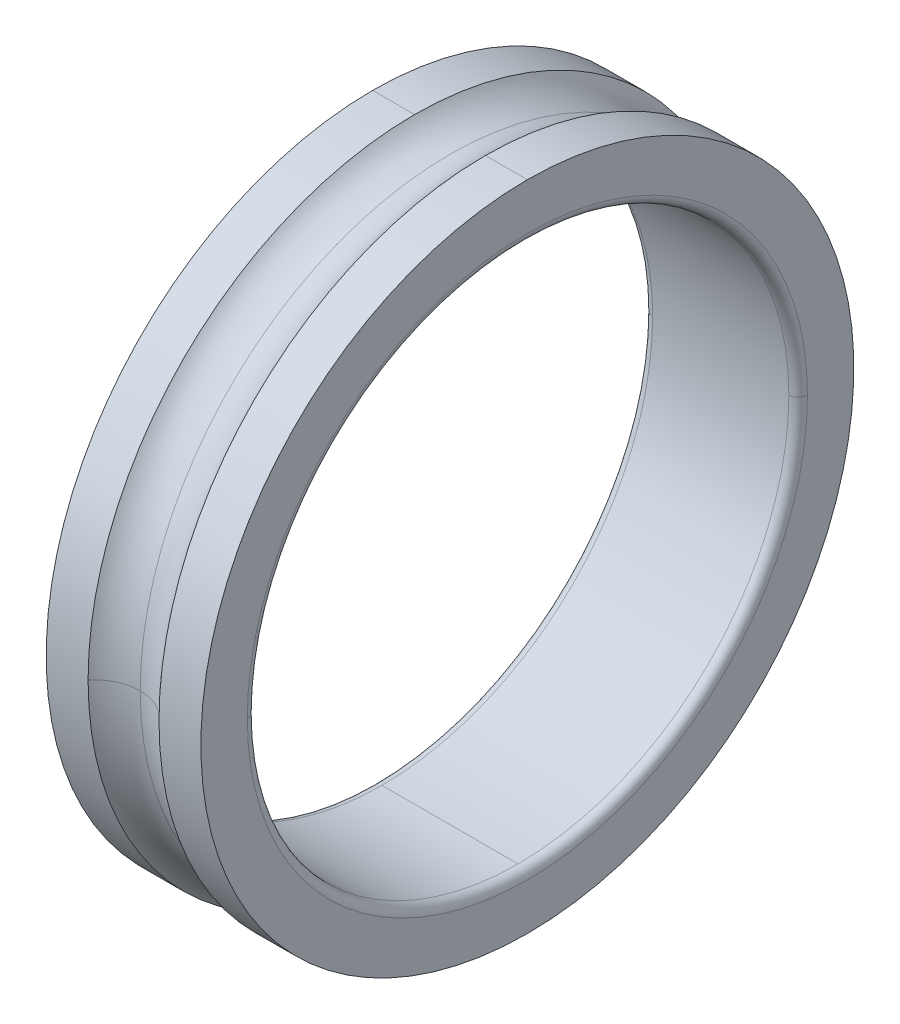
ISO-10303-21;
HEADER;
FILE_DESCRIPTION(('STEP AP214'),'2;1');
FILE_NAME('part.step','',(''),(''),'','','');
FILE_SCHEMA(('AUTOMOTIVE_DESIGN { 1 0 10303 214 1 1 1 1 }'));
ENDSEC;
DATA;
#1=APPLICATION_CONTEXT('core data for automotive mechanical design processes');
#2=APPLICATION_PROTOCOL_DEFINITION('international standard','automotive_design',2000,#1);
#3=PRODUCT_CONTEXT('',#1,'mechanical');
#4=PRODUCT('Part','Part','',(#3));
#5=PRODUCT_RELATED_PRODUCT_CATEGORY('part','',(#4));
#6=PRODUCT_DEFINITION_FORMATION('','',#4);
#7=PRODUCT_DEFINITION_CONTEXT('part definition',#1,'design');
#8=PRODUCT_DEFINITION('design','',#6,#7);
#9=PRODUCT_DEFINITION_SHAPE('','',#8);
#10=(LENGTH_UNIT() NAMED_UNIT(*) SI_UNIT(.MILLI.,.METRE.));
#11=(NAMED_UNIT(*) PLANE_ANGLE_UNIT() SI_UNIT($,.RADIAN.));
#12=(NAMED_UNIT(*) SI_UNIT($,.STERADIAN.) SOLID_ANGLE_UNIT());
#13=UNCERTAINTY_MEASURE_WITH_UNIT(LENGTH_MEASURE(1.E-05),#10,'distance_accuracy_value','');
#14=(GEOMETRIC_REPRESENTATION_CONTEXT(3) GLOBAL_UNCERTAINTY_ASSIGNED_CONTEXT((#13)) GLOBAL_UNIT_ASSIGNED_CONTEXT((#10,
#11,#12)) REPRESENTATION_CONTEXT('',''));
#15=CARTESIAN_POINT('',(0.,0.,0.));
#16=DIRECTION('',(0.,0.,1.));
#17=DIRECTION('',(1.,0.,0.));
#18=AXIS2_PLACEMENT_3D('',#15,#16,#17);
#19=CARTESIAN_POINT('',(8.64559506916711,0.,0.));
#20=DIRECTION('',(1.,0.,0.));
#21=DIRECTION('',(0.,1.,0.));
#22=AXIS2_PLACEMENT_3D('',#19,#20,#21);
#23=CYLINDRICAL_SURFACE('',#22,21.1);
#24=DIRECTION('',(1.,0.,0.));
#25=VECTOR('',#24,1.);
#26=CARTESIAN_POINT('',(8.64559506916711,21.1,0.));
#27=LINE('',#26,#25);
#28=CARTESIAN_POINT('',(7.29119013833422,21.1,0.));
#29=VERTEX_POINT('',#28);
#30=CARTESIAN_POINT('',(10.,21.1,0.));
#31=VERTEX_POINT('',#30);
#32=EDGE_CURVE('E183',#29,#31,#27,.T.);
#33=ORIENTED_EDGE('',*,*,#32,.T.);
#34=CARTESIAN_POINT('',(10.,0.,0.));
#35=DIRECTION('',(1.,0.,0.));
#36=DIRECTION('',(0.,1.,0.));
#37=AXIS2_PLACEMENT_3D('',#34,#35,#36);
#38=CIRCLE('',#37,21.1);
#39=CARTESIAN_POINT('',(10.,-21.1,0.));
#40=VERTEX_POINT('',#39);
#41=EDGE_CURVE('E136',#40,#31,#38,.T.);
#42=ORIENTED_EDGE('',*,*,#41,.F.);
#43=DIRECTION('',(-1.,0.,0.));
#44=VECTOR('',#43,1.);
#45=CARTESIAN_POINT('',(8.64559506916711,-21.1,0.));
#46=LINE('',#45,#44);
#47=CARTESIAN_POINT('',(7.29119013833422,-21.1,0.));
#48=VERTEX_POINT('',#47);
#49=EDGE_CURVE('E191',#40,#48,#46,.T.);
#50=ORIENTED_EDGE('',*,*,#49,.T.);
#51=CARTESIAN_POINT('',(7.29119013833422,0.,0.));
#52=DIRECTION('',(1.,0.,0.));
#53=DIRECTION('',(0.,1.,0.));
#54=AXIS2_PLACEMENT_3D('',#51,#52,#53);
#55=CIRCLE('',#54,21.1);
#56=CARTESIAN_POINT('',(7.29119013833422,0.,-21.1));
#57=VERTEX_POINT('',#56);
#58=EDGE_CURVE('E174',#48,#57,#55,.T.);
#59=ORIENTED_EDGE('',*,*,#58,.T.);
#60=CARTESIAN_POINT('',(7.29119013833422,0.,0.));
#61=DIRECTION('',(1.,0.,0.));
#62=DIRECTION('',(0.,1.,0.));
#63=AXIS2_PLACEMENT_3D('',#60,#61,#62);
#64=CIRCLE('',#63,21.1);
#65=EDGE_CURVE('E180',#57,#29,#64,.T.);
#66=ORIENTED_EDGE('',*,*,#65,.T.);
#67=EDGE_LOOP('',(#33,#42,#50,#59,#66));
#68=FACE_BOUND('',#67,.T.);
#69=ADVANCED_FACE('F16',(#68),#23,.T.);
#70=CARTESIAN_POINT('',(5.,0.,0.));
#71=DIRECTION('',(1.,0.,0.));
#72=DIRECTION('',(0.,0.,-1.));
#73=AXIS2_PLACEMENT_3D('',#70,#71,#72);
#74=TOROIDAL_SURFACE('',#73,23.,2.9765);
#75=CARTESIAN_POINT('',(5.,0.,0.));
#76=DIRECTION('',(-1.,0.,0.));
#77=DIRECTION('',(0.,0.,1.));
#78=AXIS2_PLACEMENT_3D('',#75,#76,#77);
#79=CIRCLE('',#78,20.0235);
#80=CARTESIAN_POINT('',(5.,0.,20.0235));
#81=VERTEX_POINT('',#80);
#82=CARTESIAN_POINT('',(5.,0.,-20.0235));
#83=VERTEX_POINT('',#82);
#84=EDGE_CURVE('E167',#81,#83,#79,.T.);
#85=ORIENTED_EDGE('',*,*,#84,.T.);
#86=CARTESIAN_POINT('',(5.,0.,-23.));
#87=DIRECTION('',(0.,-1.,0.));
#88=DIRECTION('',(0.,0.,-1.));
#89=AXIS2_PLACEMENT_3D('',#86,#87,#88);
#90=CIRCLE('',#89,2.9765);
#91=CARTESIAN_POINT('',(2.70880986166578,0.,-21.1));
#92=VERTEX_POINT('',#91);
#93=EDGE_CURVE('E160',#83,#92,#90,.T.);
#94=ORIENTED_EDGE('',*,*,#93,.T.);
#95=CARTESIAN_POINT('',(2.70880986166578,0.,0.));
#96=DIRECTION('',(1.,0.,0.));
#97=DIRECTION('',(0.,1.,0.));
#98=AXIS2_PLACEMENT_3D('',#95,#96,#97);
#99=CIRCLE('',#98,21.1);
#100=CARTESIAN_POINT('',(2.70880986166578,21.1,0.));
#101=VERTEX_POINT('',#100);
#102=EDGE_CURVE('E11',#92,#101,#99,.T.);
#103=ORIENTED_EDGE('',*,*,#102,.T.);
#104=CARTESIAN_POINT('',(2.70880986166578,0.,0.));
#105=DIRECTION('',(1.,0.,0.));
#106=DIRECTION('',(0.,1.,0.));
#107=AXIS2_PLACEMENT_3D('',#104,#105,#106);
#108=CIRCLE('',#107,21.1);
#109=CARTESIAN_POINT('',(2.70880986166578,0.,21.1));
#110=VERTEX_POINT('',#109);
#111=EDGE_CURVE('E159',#101,#110,#108,.T.);
#112=ORIENTED_EDGE('',*,*,#111,.T.);
#113=CARTESIAN_POINT('',(5.,0.,23.));
#114=DIRECTION('',(0.,-1.,0.));
#115=DIRECTION('',(0.,0.,1.));
#116=AXIS2_PLACEMENT_3D('',#113,#114,#115);
#117=CIRCLE('',#116,2.9765);
#118=EDGE_CURVE('E201',#110,#81,#117,.T.);
#119=ORIENTED_EDGE('',*,*,#118,.T.);
#120=EDGE_LOOP('',(#85,#94,#103,#112,#119));
#121=FACE_BOUND('',#120,.T.);
#122=ADVANCED_FACE('F259',(#121),#74,.F.);
#123=CARTESIAN_POINT('',(1.35440493083289,0.,0.));
#124=DIRECTION('',(1.,0.,0.));
#125=DIRECTION('',(0.,1.,0.));
#126=AXIS2_PLACEMENT_3D('',#123,#124,#125);
#127=CYLINDRICAL_SURFACE('',#126,21.1);
#128=DIRECTION('',(1.,0.,0.));
#129=VECTOR('',#128,1.);
#130=CARTESIAN_POINT('',(1.35440493083289,21.1,0.));
#131=LINE('',#130,#129);
#132=CARTESIAN_POINT('',(0.,21.1,0.));
#133=VERTEX_POINT('',#132);
#134=EDGE_CURVE('E147',#133,#101,#131,.T.);
#135=ORIENTED_EDGE('',*,*,#134,.T.);
#136=ORIENTED_EDGE('',*,*,#102,.F.);
#137=CARTESIAN_POINT('',(2.70880986166578,0.,0.));
#138=DIRECTION('',(1.,0.,0.));
#139=DIRECTION('',(0.,1.,0.));
#140=AXIS2_PLACEMENT_3D('',#137,#138,#139);
#141=CIRCLE('',#140,21.1);
#142=CARTESIAN_POINT('',(2.70880986166578,-21.1,0.));
#143=VERTEX_POINT('',#142);
#144=EDGE_CURVE('E163',#143,#92,#141,.T.);
#145=ORIENTED_EDGE('',*,*,#144,.F.);
#146=DIRECTION('',(-1.,0.,0.));
#147=VECTOR('',#146,1.);
#148=CARTESIAN_POINT('',(1.35440493083289,-21.1,0.));
#149=LINE('',#148,#147);
#150=CARTESIAN_POINT('',(0.,-21.1,0.));
#151=VERTEX_POINT('',#150);
#152=EDGE_CURVE('E149',#143,#151,#149,.T.);
#153=ORIENTED_EDGE('',*,*,#152,.T.);
#154=CARTESIAN_POINT('',(0.,0.,0.));
#155=DIRECTION('',(1.,0.,0.));
#156=DIRECTION('',(0.,1.,0.));
#157=AXIS2_PLACEMENT_3D('',#154,#155,#156);
#158=CIRCLE('',#157,21.1);
#159=EDGE_CURVE('E23',#151,#133,#158,.T.);
#160=ORIENTED_EDGE('',*,*,#159,.T.);
#161=EDGE_LOOP('',(#135,#136,#145,#153,#160));
#162=FACE_BOUND('',#161,.T.);
#163=ADVANCED_FACE('F145',(#162),#127,.T.);
#164=CARTESIAN_POINT('',(0.,19.6,0.));
#165=DIRECTION('',(-1.,0.,0.));
#166=DIRECTION('',(0.,0.,1.));
#167=AXIS2_PLACEMENT_3D('',#164,#165,#166);
#168=PLANE('',#167);
#169=CARTESIAN_POINT('',(0.,0.,0.));
#170=DIRECTION('',(1.,0.,0.));
#171=DIRECTION('',(0.,1.,0.));
#172=AXIS2_PLACEMENT_3D('',#169,#170,#171);
#173=CIRCLE('',#172,18.1);
#174=CARTESIAN_POINT('',(0.,0.,18.1));
#175=VERTEX_POINT('',#174);
#176=CARTESIAN_POINT('',(0.,0.,-18.1));
#177=VERTEX_POINT('',#176);
#178=EDGE_CURVE('E139',#175,#177,#173,.T.);
#179=ORIENTED_EDGE('',*,*,#178,.T.);
#180=CARTESIAN_POINT('',(0.,0.,0.));
#181=DIRECTION('',(1.,0.,0.));
#182=DIRECTION('',(0.,1.,0.));
#183=AXIS2_PLACEMENT_3D('',#180,#181,#182);
#184=CIRCLE('',#183,18.1);
#185=EDGE_CURVE('E222',#177,#175,#184,.T.);
#186=ORIENTED_EDGE('',*,*,#185,.T.);
#187=EDGE_LOOP('',(#179,#186));
#188=FACE_BOUND('',#187,.T.);
#189=CARTESIAN_POINT('',(0.,0.,0.));
#190=DIRECTION('',(1.,0.,0.));
#191=DIRECTION('',(0.,1.,0.));
#192=AXIS2_PLACEMENT_3D('',#189,#190,#191);
#193=CIRCLE('',#192,21.1);
#194=EDGE_CURVE('E152',#133,#151,#193,.T.);
#195=ORIENTED_EDGE('',*,*,#194,.F.);
#196=ORIENTED_EDGE('',*,*,#159,.F.);
#197=EDGE_LOOP('',(#195,#196));
#198=FACE_BOUND('',#197,.T.);
#199=ADVANCED_FACE('F153',(#188,#198),#168,.T.);
#200=CARTESIAN_POINT('',(0.6,0.,0.));
#201=DIRECTION('',(1.,0.,0.));
#202=DIRECTION('',(0.,0.,-1.));
#203=AXIS2_PLACEMENT_3D('',#200,#201,#202);
#204=TOROIDAL_SURFACE('',#203,18.1,0.6);
#205=CARTESIAN_POINT('',(0.6,0.,-18.1));
#206=DIRECTION('',(0.,-1.,0.));
#207=DIRECTION('',(0.,0.,-1.));
#208=AXIS2_PLACEMENT_3D('',#205,#206,#207);
#209=CIRCLE('',#208,0.6);
#210=CARTESIAN_POINT('',(0.6,0.,-17.5));
#211=VERTEX_POINT('',#210);
#212=EDGE_CURVE('E210',#211,#177,#209,.T.);
#213=ORIENTED_EDGE('',*,*,#212,.T.);
#214=ORIENTED_EDGE('',*,*,#178,.F.);
#215=CARTESIAN_POINT('',(0.6,0.,18.1));
#216=DIRECTION('',(0.,-1.,0.));
#217=DIRECTION('',(0.,0.,1.));
#218=AXIS2_PLACEMENT_3D('',#215,#216,#217);
#219=CIRCLE('',#218,0.6);
#220=CARTESIAN_POINT('',(0.6,0.,17.5));
#221=VERTEX_POINT('',#220);
#222=EDGE_CURVE('E219',#175,#221,#219,.T.);
#223=ORIENTED_EDGE('',*,*,#222,.T.);
#224=CARTESIAN_POINT('',(0.6,0.,0.));
#225=DIRECTION('',(1.,0.,0.));
#226=DIRECTION('',(0.,1.,0.));
#227=AXIS2_PLACEMENT_3D('',#224,#225,#226);
#228=CIRCLE('',#227,17.5);
#229=CARTESIAN_POINT('',(0.6,-17.5,0.));
#230=VERTEX_POINT('',#229);
#231=EDGE_CURVE('E137',#221,#230,#228,.T.);
#232=ORIENTED_EDGE('',*,*,#231,.T.);
#233=CARTESIAN_POINT('',(0.6,0.,0.));
#234=DIRECTION('',(1.,0.,0.));
#235=DIRECTION('',(0.,1.,0.));
#236=AXIS2_PLACEMENT_3D('',#233,#234,#235);
#237=CIRCLE('',#236,17.5);
#238=EDGE_CURVE('E129',#230,#211,#237,.T.);
#239=ORIENTED_EDGE('',*,*,#238,.T.);
#240=EDGE_LOOP('',(#213,#214,#223,#232,#239));
#241=FACE_BOUND('',#240,.T.);
#242=ADVANCED_FACE('F228',(#241),#204,.T.);
#243=CARTESIAN_POINT('',(5.,0.,0.));
#244=DIRECTION('',(1.,0.,0.));
#245=DIRECTION('',(0.,1.,0.));
#246=AXIS2_PLACEMENT_3D('',#243,#244,#245);
#247=CYLINDRICAL_SURFACE('',#246,17.5);
#248=DIRECTION('',(1.,0.,0.));
#249=VECTOR('',#248,1.);
#250=CARTESIAN_POINT('',(5.,17.5,0.));
#251=LINE('',#250,#249);
#252=CARTESIAN_POINT('',(0.6,17.5,0.));
#253=VERTEX_POINT('',#252);
#254=CARTESIAN_POINT('',(9.4,17.5,0.));
#255=VERTEX_POINT('',#254);
#256=EDGE_CURVE('E225',#253,#255,#251,.T.);
#257=ORIENTED_EDGE('',*,*,#256,.T.);
#258=CARTESIAN_POINT('',(9.4,0.,0.));
#259=DIRECTION('',(1.,0.,0.));
#260=DIRECTION('',(0.,1.,0.));
#261=AXIS2_PLACEMENT_3D('',#258,#259,#260);
#262=CIRCLE('',#261,17.5);
#263=CARTESIAN_POINT('',(9.4,0.,17.5));
#264=VERTEX_POINT('',#263);
#265=EDGE_CURVE('E120',#255,#264,#262,.T.);
#266=ORIENTED_EDGE('',*,*,#265,.T.);
#267=CARTESIAN_POINT('',(9.4,0.,0.));
#268=DIRECTION('',(1.,0.,0.));
#269=DIRECTION('',(0.,1.,0.));
#270=AXIS2_PLACEMENT_3D('',#267,#268,#269);
#271=CIRCLE('',#270,17.5);
#272=CARTESIAN_POINT('',(9.4,-17.5,0.));
#273=VERTEX_POINT('',#272);
#274=EDGE_CURVE('E30',#264,#273,#271,.T.);
#275=ORIENTED_EDGE('',*,*,#274,.T.);
#276=DIRECTION('',(-1.,0.,0.));
#277=VECTOR('',#276,1.);
#278=CARTESIAN_POINT('',(5.,-17.5,0.));
#279=LINE('',#278,#277);
#280=EDGE_CURVE('E127',#273,#230,#279,.T.);
#281=ORIENTED_EDGE('',*,*,#280,.T.);
#282=ORIENTED_EDGE('',*,*,#231,.F.);
#283=CARTESIAN_POINT('',(0.6,0.,0.));
#284=DIRECTION('',(1.,0.,0.));
#285=DIRECTION('',(0.,1.,0.));
#286=AXIS2_PLACEMENT_3D('',#283,#284,#285);
#287=CIRCLE('',#286,17.5);
#288=EDGE_CURVE('E216',#253,#221,#287,.T.);
#289=ORIENTED_EDGE('',*,*,#288,.F.);
#290=EDGE_LOOP('',(#257,#266,#275,#281,#282,#289));
#291=FACE_BOUND('',#290,.T.);
#292=ADVANCED_FACE('F237',(#291),#247,.F.);
#293=CARTESIAN_POINT('',(9.4,0.,0.));
#294=DIRECTION('',(1.,0.,0.));
#295=DIRECTION('',(0.,0.,-1.));
#296=AXIS2_PLACEMENT_3D('',#293,#294,#295);
#297=TOROIDAL_SURFACE('',#296,18.1,0.6);
#298=CARTESIAN_POINT('',(9.4,0.,-18.1));
#299=DIRECTION('',(0.,-1.,0.));
#300=DIRECTION('',(0.,0.,-1.));
#301=AXIS2_PLACEMENT_3D('',#298,#299,#300);
#302=CIRCLE('',#301,0.6);
#303=CARTESIAN_POINT('',(10.,0.,-18.1));
#304=VERTEX_POINT('',#303);
#305=CARTESIAN_POINT('',(9.4,0.,-17.5));
#306=VERTEX_POINT('',#305);
#307=EDGE_CURVE('E106',#304,#306,#302,.T.);
#308=ORIENTED_EDGE('',*,*,#307,.T.);
#309=CARTESIAN_POINT('',(9.4,0.,0.));
#310=DIRECTION('',(1.,0.,0.));
#311=DIRECTION('',(0.,1.,0.));
#312=AXIS2_PLACEMENT_3D('',#309,#310,#311);
#313=CIRCLE('',#312,17.5);
#314=EDGE_CURVE('E110',#273,#306,#313,.T.);
#315=ORIENTED_EDGE('',*,*,#314,.F.);
#316=ORIENTED_EDGE('',*,*,#274,.F.);
#317=CARTESIAN_POINT('',(9.4,0.,18.1));
#318=DIRECTION('',(0.,-1.,0.));
#319=DIRECTION('',(0.,0.,1.));
#320=AXIS2_PLACEMENT_3D('',#317,#318,#319);
#321=CIRCLE('',#320,0.6);
#322=CARTESIAN_POINT('',(10.,0.,18.1));
#323=VERTEX_POINT('',#322);
#324=EDGE_CURVE('E133',#264,#323,#321,.T.);
#325=ORIENTED_EDGE('',*,*,#324,.T.);
#326=CARTESIAN_POINT('',(10.,0.,0.));
#327=DIRECTION('',(1.,0.,0.));
#328=DIRECTION('',(0.,1.,0.));
#329=AXIS2_PLACEMENT_3D('',#326,#327,#328);
#330=CIRCLE('',#329,18.1);
#331=EDGE_CURVE('E38',#323,#304,#330,.T.);
#332=ORIENTED_EDGE('',*,*,#331,.T.);
#333=EDGE_LOOP('',(#308,#315,#316,#325,#332));
#334=FACE_BOUND('',#333,.T.);
#335=ADVANCED_FACE('F108',(#334),#297,.T.);
#336=CARTESIAN_POINT('',(10.,19.6,0.));
#337=DIRECTION('',(1.,0.,0.));
#338=DIRECTION('',(0.,1.,0.));
#339=AXIS2_PLACEMENT_3D('',#336,#337,#338);
#340=PLANE('',#339);
#341=CARTESIAN_POINT('',(10.,0.,0.));
#342=DIRECTION('',(1.,0.,0.));
#343=DIRECTION('',(0.,1.,0.));
#344=AXIS2_PLACEMENT_3D('',#341,#342,#343);
#345=CIRCLE('',#344,18.1);
#346=EDGE_CURVE('E114',#304,#323,#345,.T.);
#347=ORIENTED_EDGE('',*,*,#346,.F.);
#348=ORIENTED_EDGE('',*,*,#331,.F.);
#349=EDGE_LOOP('',(#347,#348));
#350=FACE_BOUND('',#349,.T.);
#351=CARTESIAN_POINT('',(10.,0.,0.));
#352=DIRECTION('',(1.,0.,0.));
#353=DIRECTION('',(0.,1.,0.));
#354=AXIS2_PLACEMENT_3D('',#351,#352,#353);
#355=CIRCLE('',#354,21.1);
#356=EDGE_CURVE('E193',#31,#40,#355,.T.);
#357=ORIENTED_EDGE('',*,*,#356,.T.);
#358=ORIENTED_EDGE('',*,*,#41,.T.);
#359=EDGE_LOOP('',(#357,#358));
#360=FACE_BOUND('',#359,.T.);
#361=ADVANCED_FACE('F238',(#350,#360),#340,.T.);
#362=CARTESIAN_POINT('',(9.4,0.,0.));
#363=DIRECTION('',(1.,0.,0.));
#364=DIRECTION('',(0.,0.,-1.));
#365=AXIS2_PLACEMENT_3D('',#362,#363,#364);
#366=TOROIDAL_SURFACE('',#365,18.1,0.6);
#367=ORIENTED_EDGE('',*,*,#307,.F.);
#368=ORIENTED_EDGE('',*,*,#346,.T.);
#369=ORIENTED_EDGE('',*,*,#324,.F.);
#370=ORIENTED_EDGE('',*,*,#265,.F.);
#371=CARTESIAN_POINT('',(9.4,0.,0.));
#372=DIRECTION('',(1.,0.,0.));
#373=DIRECTION('',(0.,1.,0.));
#374=AXIS2_PLACEMENT_3D('',#371,#372,#373);
#375=CIRCLE('',#374,17.5);
#376=EDGE_CURVE('E115',#306,#255,#375,.T.);
#377=ORIENTED_EDGE('',*,*,#376,.F.);
#378=EDGE_LOOP('',(#367,#368,#369,#370,#377));
#379=FACE_BOUND('',#378,.T.);
#380=ADVANCED_FACE('F118',(#379),#366,.T.);
#381=CARTESIAN_POINT('',(5.,0.,0.));
#382=DIRECTION('',(1.,0.,0.));
#383=DIRECTION('',(0.,1.,0.));
#384=AXIS2_PLACEMENT_3D('',#381,#382,#383);
#385=CYLINDRICAL_SURFACE('',#384,17.5);
#386=ORIENTED_EDGE('',*,*,#256,.F.);
#387=CARTESIAN_POINT('',(0.6,0.,0.));
#388=DIRECTION('',(1.,0.,0.));
#389=DIRECTION('',(0.,1.,0.));
#390=AXIS2_PLACEMENT_3D('',#387,#388,#389);
#391=CIRCLE('',#390,17.5);
#392=EDGE_CURVE('E213',#211,#253,#391,.T.);
#393=ORIENTED_EDGE('',*,*,#392,.F.);
#394=ORIENTED_EDGE('',*,*,#238,.F.);
#395=ORIENTED_EDGE('',*,*,#280,.F.);
#396=ORIENTED_EDGE('',*,*,#314,.T.);
#397=ORIENTED_EDGE('',*,*,#376,.T.);
#398=EDGE_LOOP('',(#386,#393,#394,#395,#396,#397));
#399=FACE_BOUND('',#398,.T.);
#400=ADVANCED_FACE('F124',(#399),#385,.F.);
#401=CARTESIAN_POINT('',(0.6,0.,0.));
#402=DIRECTION('',(1.,0.,0.));
#403=DIRECTION('',(0.,0.,-1.));
#404=AXIS2_PLACEMENT_3D('',#401,#402,#403);
#405=TOROIDAL_SURFACE('',#404,18.1,0.6);
#406=ORIENTED_EDGE('',*,*,#212,.F.);
#407=ORIENTED_EDGE('',*,*,#392,.T.);
#408=ORIENTED_EDGE('',*,*,#288,.T.);
#409=ORIENTED_EDGE('',*,*,#222,.F.);
#410=ORIENTED_EDGE('',*,*,#185,.F.);
#411=EDGE_LOOP('',(#406,#407,#408,#409,#410));
#412=FACE_BOUND('',#411,.T.);
#413=ADVANCED_FACE('F233',(#412),#405,.T.);
#414=CARTESIAN_POINT('',(1.35440493083289,0.,0.));
#415=DIRECTION('',(1.,0.,0.));
#416=DIRECTION('',(0.,1.,0.));
#417=AXIS2_PLACEMENT_3D('',#414,#415,#416);
#418=CYLINDRICAL_SURFACE('',#417,21.1);
#419=ORIENTED_EDGE('',*,*,#134,.F.);
#420=ORIENTED_EDGE('',*,*,#194,.T.);
#421=ORIENTED_EDGE('',*,*,#152,.F.);
#422=CARTESIAN_POINT('',(2.70880986166578,0.,0.));
#423=DIRECTION('',(1.,0.,0.));
#424=DIRECTION('',(0.,1.,0.));
#425=AXIS2_PLACEMENT_3D('',#422,#423,#424);
#426=CIRCLE('',#425,21.1);
#427=EDGE_CURVE('E203',#110,#143,#426,.T.);
#428=ORIENTED_EDGE('',*,*,#427,.F.);
#429=ORIENTED_EDGE('',*,*,#111,.F.);
#430=EDGE_LOOP('',(#419,#420,#421,#428,#429));
#431=FACE_BOUND('',#430,.T.);
#432=ADVANCED_FACE('F157',(#431),#418,.T.);
#433=CARTESIAN_POINT('',(5.,0.,0.));
#434=DIRECTION('',(1.,0.,0.));
#435=DIRECTION('',(0.,0.,-1.));
#436=AXIS2_PLACEMENT_3D('',#433,#434,#435);
#437=TOROIDAL_SURFACE('',#436,23.,2.9765);
#438=CARTESIAN_POINT('',(5.,0.,0.));
#439=DIRECTION('',(-1.,0.,0.));
#440=DIRECTION('',(0.,0.,1.));
#441=AXIS2_PLACEMENT_3D('',#438,#439,#440);
#442=CIRCLE('',#441,20.0235);
#443=EDGE_CURVE('E177',#83,#81,#442,.T.);
#444=ORIENTED_EDGE('',*,*,#443,.T.);
#445=ORIENTED_EDGE('',*,*,#118,.F.);
#446=ORIENTED_EDGE('',*,*,#427,.T.);
#447=ORIENTED_EDGE('',*,*,#144,.T.);
#448=ORIENTED_EDGE('',*,*,#93,.F.);
#449=EDGE_LOOP('',(#444,#445,#446,#447,#448));
#450=FACE_BOUND('',#449,.T.);
#451=ADVANCED_FACE('F262',(#450),#437,.F.);
#452=CARTESIAN_POINT('',(8.64559506916711,0.,0.));
#453=DIRECTION('',(1.,0.,0.));
#454=DIRECTION('',(0.,1.,0.));
#455=AXIS2_PLACEMENT_3D('',#452,#453,#454);
#456=CYLINDRICAL_SURFACE('',#455,21.1);
#457=ORIENTED_EDGE('',*,*,#32,.F.);
#458=CARTESIAN_POINT('',(7.29119013833422,0.,0.));
#459=DIRECTION('',(1.,0.,0.));
#460=DIRECTION('',(0.,1.,0.));
#461=AXIS2_PLACEMENT_3D('',#458,#459,#460);
#462=CIRCLE('',#461,21.1);
#463=CARTESIAN_POINT('',(7.29119013833422,0.,21.1));
#464=VERTEX_POINT('',#463);
#465=EDGE_CURVE('E173',#29,#464,#462,.T.);
#466=ORIENTED_EDGE('',*,*,#465,.T.);
#467=CARTESIAN_POINT('',(7.29119013833422,0.,0.));
#468=DIRECTION('',(1.,0.,0.));
#469=DIRECTION('',(0.,1.,0.));
#470=AXIS2_PLACEMENT_3D('',#467,#468,#469);
#471=CIRCLE('',#470,21.1);
#472=EDGE_CURVE('E176',#464,#48,#471,.T.);
#473=ORIENTED_EDGE('',*,*,#472,.T.);
#474=ORIENTED_EDGE('',*,*,#49,.F.);
#475=ORIENTED_EDGE('',*,*,#356,.F.);
#476=EDGE_LOOP('',(#457,#466,#473,#474,#475));
#477=FACE_BOUND('',#476,.T.);
#478=ADVANCED_FACE('F245',(#477),#456,.T.);
#479=CARTESIAN_POINT('',(5.,0.,0.));
#480=DIRECTION('',(1.,0.,0.));
#481=DIRECTION('',(0.,0.,-1.));
#482=AXIS2_PLACEMENT_3D('',#479,#480,#481);
#483=TOROIDAL_SURFACE('',#482,23.,2.9765);
#484=ORIENTED_EDGE('',*,*,#443,.F.);
#485=CARTESIAN_POINT('',(5.,0.,-23.));
#486=DIRECTION('',(0.,-1.,0.));
#487=DIRECTION('',(0.,0.,-1.));
#488=AXIS2_PLACEMENT_3D('',#485,#486,#487);
#489=CIRCLE('',#488,2.9765);
#490=EDGE_CURVE('E187',#57,#83,#489,.T.);
#491=ORIENTED_EDGE('',*,*,#490,.F.);
#492=ORIENTED_EDGE('',*,*,#58,.F.);
#493=ORIENTED_EDGE('',*,*,#472,.F.);
#494=CARTESIAN_POINT('',(5.,0.,23.));
#495=DIRECTION('',(0.,-1.,0.));
#496=DIRECTION('',(0.,0.,1.));
#497=AXIS2_PLACEMENT_3D('',#494,#495,#496);
#498=CIRCLE('',#497,2.9765);
#499=EDGE_CURVE('E170',#81,#464,#498,.T.);
#500=ORIENTED_EDGE('',*,*,#499,.F.);
#501=EDGE_LOOP('',(#484,#491,#492,#493,#500));
#502=FACE_BOUND('',#501,.T.);
#503=ADVANCED_FACE('F257',(#502),#483,.F.);
#504=CARTESIAN_POINT('',(5.,0.,0.));
#505=DIRECTION('',(1.,0.,0.));
#506=DIRECTION('',(0.,0.,-1.));
#507=AXIS2_PLACEMENT_3D('',#504,#505,#506);
#508=TOROIDAL_SURFACE('',#507,23.,2.9765);
#509=ORIENTED_EDGE('',*,*,#84,.F.);
#510=ORIENTED_EDGE('',*,*,#499,.T.);
#511=ORIENTED_EDGE('',*,*,#465,.F.);
#512=ORIENTED_EDGE('',*,*,#65,.F.);
#513=ORIENTED_EDGE('',*,*,#490,.T.);
#514=EDGE_LOOP('',(#509,#510,#511,#512,#513));
#515=FACE_BOUND('',#514,.T.);
#516=ADVANCED_FACE('F254',(#515),#508,.F.);
#517=CLOSED_SHELL('',(#69,#122,#163,#199,#242,#292,#335,#361,#380,#400,#413,#432,#451,#478,#503,#516));
#518=MANIFOLD_SOLID_BREP('B1',#517);
#519=ADVANCED_BREP_SHAPE_REPRESENTATION('',(#18,#518),#14);
#520=SHAPE_DEFINITION_REPRESENTATION(#9,#519);
ENDSEC;
END-ISO-10303-21;
